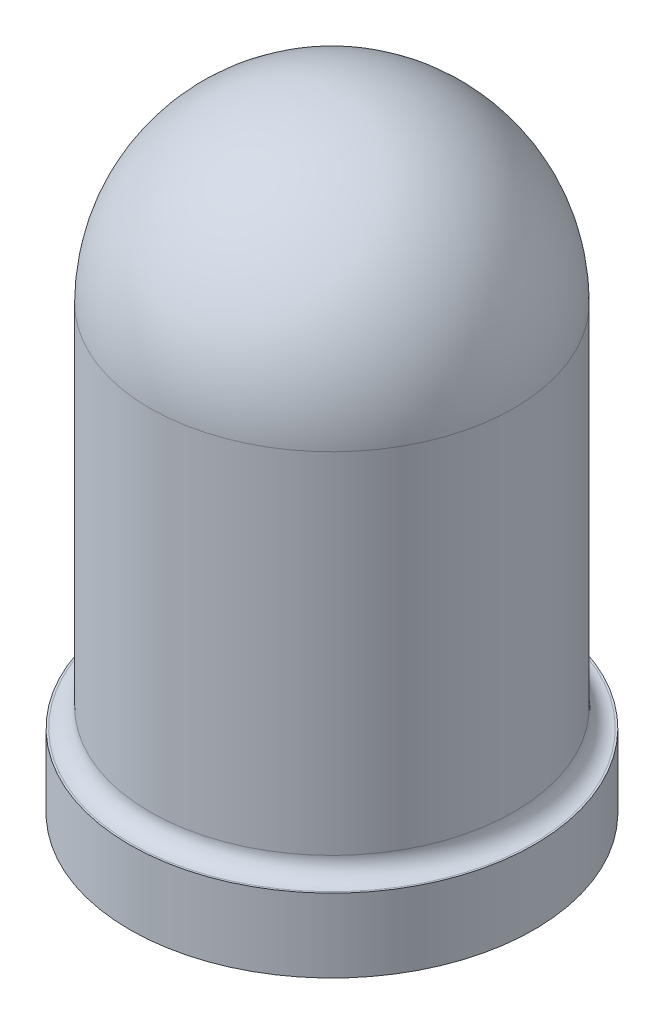
ISO-10303-21;
HEADER;
FILE_DESCRIPTION(('STEP AP214'),'2;1');
FILE_NAME('part.step','',(''),(''),'','','');
FILE_SCHEMA(('AUTOMOTIVE_DESIGN { 1 0 10303 214 1 1 1 1 }'));
ENDSEC;
DATA;
#1=APPLICATION_CONTEXT('core data for automotive mechanical design processes');
#2=APPLICATION_PROTOCOL_DEFINITION('international standard','automotive_design',2000,#1);
#3=PRODUCT_CONTEXT('',#1,'mechanical');
#4=PRODUCT('Part','Part','',(#3));
#5=PRODUCT_RELATED_PRODUCT_CATEGORY('part','',(#4));
#6=PRODUCT_DEFINITION_FORMATION('','',#4);
#7=PRODUCT_DEFINITION_CONTEXT('part definition',#1,'design');
#8=PRODUCT_DEFINITION('design','',#6,#7);
#9=PRODUCT_DEFINITION_SHAPE('','',#8);
#10=(LENGTH_UNIT() NAMED_UNIT(*) SI_UNIT(.MILLI.,.METRE.));
#11=(NAMED_UNIT(*) PLANE_ANGLE_UNIT() SI_UNIT($,.RADIAN.));
#12=(NAMED_UNIT(*) SI_UNIT($,.STERADIAN.) SOLID_ANGLE_UNIT());
#13=UNCERTAINTY_MEASURE_WITH_UNIT(LENGTH_MEASURE(1.E-05),#10,'distance_accuracy_value','');
#14=(GEOMETRIC_REPRESENTATION_CONTEXT(3) GLOBAL_UNCERTAINTY_ASSIGNED_CONTEXT((#13)) GLOBAL_UNIT_ASSIGNED_CONTEXT((#10,
#11,#12)) REPRESENTATION_CONTEXT('',''));
#15=CARTESIAN_POINT('',(0.,0.,0.));
#16=DIRECTION('',(0.,0.,1.));
#17=DIRECTION('',(1.,0.,0.));
#18=AXIS2_PLACEMENT_3D('',#15,#16,#17);
#19=CARTESIAN_POINT('',(0.,6.005,0.));
#20=DIRECTION('',(0.,1.,0.));
#21=DIRECTION('',(0.,0.,1.));
#22=AXIS2_PLACEMENT_3D('',#19,#20,#21);
#23=SPHERICAL_SURFACE('',#22,2.475);
#24=CARTESIAN_POINT('',(0.,6.005,0.));
#25=DIRECTION('',(0.,1.,0.));
#26=DIRECTION('',(0.,0.,1.));
#27=AXIS2_PLACEMENT_3D('',#24,#25,#26);
#28=CIRCLE('',#27,2.475);
#29=CARTESIAN_POINT('',(0.,6.005,2.475));
#30=VERTEX_POINT('',#29);
#31=EDGE_CURVE('E10',#30,#30,#28,.T.);
#32=ORIENTED_EDGE('',*,*,#31,.T.);
#33=EDGE_LOOP('',(#32));
#34=FACE_BOUND('',#33,.T.);
#35=ADVANCED_FACE('F43',(#34),#23,.T.);
#36=CARTESIAN_POINT('',(0.,13.1713036232606,0.));
#37=DIRECTION('',(0.,1.,0.));
#38=DIRECTION('',(0.,0.,1.));
#39=AXIS2_PLACEMENT_3D('',#36,#37,#38);
#40=CYLINDRICAL_SURFACE('',#39,2.475);
#41=ORIENTED_EDGE('',*,*,#31,.F.);
#42=EDGE_LOOP('',(#41));
#43=FACE_BOUND('',#42,.T.);
#44=CARTESIAN_POINT('',(0.,1.25,0.));
#45=DIRECTION('',(0.,1.,0.));
#46=DIRECTION('',(0.,0.,1.));
#47=AXIS2_PLACEMENT_3D('',#44,#45,#46);
#48=CIRCLE('',#47,2.475);
#49=CARTESIAN_POINT('',(0.,1.25,2.475));
#50=VERTEX_POINT('',#49);
#51=EDGE_CURVE('E50',#50,#50,#48,.T.);
#52=ORIENTED_EDGE('',*,*,#51,.T.);
#53=EDGE_LOOP('',(#52));
#54=FACE_BOUND('',#53,.T.);
#55=ADVANCED_FACE('F83',(#43,#54),#40,.T.);
#56=CARTESIAN_POINT('',(0.,1.25,0.));
#57=DIRECTION('',(0.,1.,0.));
#58=DIRECTION('',(0.,0.,1.));
#59=AXIS2_PLACEMENT_3D('',#56,#57,#58);
#60=TOROIDAL_SURFACE('',#59,2.725,0.25);
#61=CARTESIAN_POINT('',(0.,0.999999999999999,0.));
#62=DIRECTION('',(0.,1.,0.));
#63=DIRECTION('',(0.,0.,1.));
#64=AXIS2_PLACEMENT_3D('',#61,#62,#63);
#65=CIRCLE('',#64,2.725);
#66=CARTESIAN_POINT('',(0.,0.999999999999999,2.725));
#67=VERTEX_POINT('',#66);
#68=EDGE_CURVE('E55',#67,#67,#65,.T.);
#69=ORIENTED_EDGE('',*,*,#68,.T.);
#70=EDGE_LOOP('',(#69));
#71=FACE_BOUND('',#70,.T.);
#72=ORIENTED_EDGE('',*,*,#51,.F.);
#73=EDGE_LOOP('',(#72));
#74=FACE_BOUND('',#73,.T.);
#75=ADVANCED_FACE('F87',(#71,#74),#60,.F.);
#76=CARTESIAN_POINT('',(0.,1.,0.));
#77=DIRECTION('',(0.,1.,0.));
#78=DIRECTION('',(0.,0.,1.));
#79=AXIS2_PLACEMENT_3D('',#76,#77,#78);
#80=PLANE('',#79);
#81=CARTESIAN_POINT('',(0.,0.999999999999999,0.));
#82=DIRECTION('',(0.,1.,0.));
#83=DIRECTION('',(0.,0.,1.));
#84=AXIS2_PLACEMENT_3D('',#81,#82,#83);
#85=CIRCLE('',#84,2.75);
#86=CARTESIAN_POINT('',(0.,0.999999999999999,2.75));
#87=VERTEX_POINT('',#86);
#88=EDGE_CURVE('E60',#87,#87,#85,.T.);
#89=ORIENTED_EDGE('',*,*,#88,.T.);
#90=EDGE_LOOP('',(#89));
#91=FACE_BOUND('',#90,.T.);
#92=ORIENTED_EDGE('',*,*,#68,.F.);
#93=EDGE_LOOP('',(#92));
#94=FACE_BOUND('',#93,.T.);
#95=ADVANCED_FACE('F79',(#91,#94),#80,.T.);
#96=CARTESIAN_POINT('',(0.,13.1713036232606,0.));
#97=DIRECTION('',(0.,1.,0.));
#98=DIRECTION('',(0.,0.,1.));
#99=AXIS2_PLACEMENT_3D('',#96,#97,#98);
#100=CYLINDRICAL_SURFACE('',#99,2.75);
#101=ORIENTED_EDGE('',*,*,#88,.F.);
#102=EDGE_LOOP('',(#101));
#103=FACE_BOUND('',#102,.T.);
#104=CARTESIAN_POINT('',(0.,0.,0.));
#105=DIRECTION('',(0.,1.,0.));
#106=DIRECTION('',(0.,0.,1.));
#107=AXIS2_PLACEMENT_3D('',#104,#105,#106);
#108=CIRCLE('',#107,2.75);
#109=CARTESIAN_POINT('',(0.,0.,2.75));
#110=VERTEX_POINT('',#109);
#111=EDGE_CURVE('E66',#110,#110,#108,.T.);
#112=ORIENTED_EDGE('',*,*,#111,.T.);
#113=EDGE_LOOP('',(#112));
#114=FACE_BOUND('',#113,.T.);
#115=ADVANCED_FACE('F71',(#103,#114),#100,.T.);
#116=CARTESIAN_POINT('',(0.,0.,0.));
#117=DIRECTION('',(0.,1.,0.));
#118=DIRECTION('',(0.,0.,1.));
#119=AXIS2_PLACEMENT_3D('',#116,#117,#118);
#120=PLANE('',#119);
#121=ORIENTED_EDGE('',*,*,#111,.F.);
#122=EDGE_LOOP('',(#121));
#123=FACE_BOUND('',#122,.T.);
#124=ADVANCED_FACE('F73',(#123),#120,.F.);
#125=CLOSED_SHELL('',(#35,#55,#75,#95,#115,#124));
#126=MANIFOLD_SOLID_BREP('B2',#125);
#127=ADVANCED_BREP_SHAPE_REPRESENTATION('',(#18,#126),#14);
#128=SHAPE_DEFINITION_REPRESENTATION(#9,#127);
ENDSEC;
END-ISO-10303-21;
